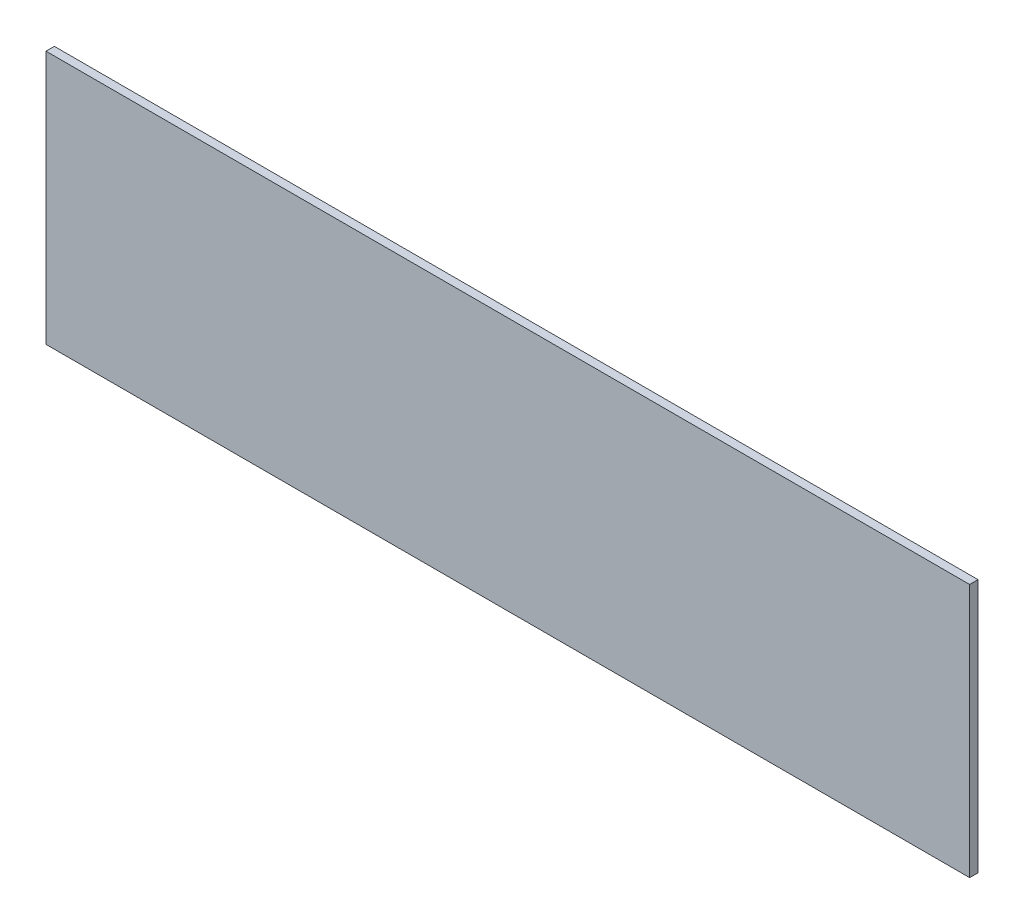
ISO-10303-21;
HEADER;
FILE_DESCRIPTION(('STEP AP214'),'2;1');
FILE_NAME('part.step','',(''),(''),'','','');
FILE_SCHEMA(('AUTOMOTIVE_DESIGN { 1 0 10303 214 1 1 1 1 }'));
ENDSEC;
DATA;
#1=APPLICATION_CONTEXT('core data for automotive mechanical design processes');
#2=APPLICATION_PROTOCOL_DEFINITION('international standard','automotive_design',2000,#1);
#3=PRODUCT_CONTEXT('',#1,'mechanical');
#4=PRODUCT('Part','Part','',(#3));
#5=PRODUCT_RELATED_PRODUCT_CATEGORY('part','',(#4));
#6=PRODUCT_DEFINITION_FORMATION('','',#4);
#7=PRODUCT_DEFINITION_CONTEXT('part definition',#1,'design');
#8=PRODUCT_DEFINITION('design','',#6,#7);
#9=PRODUCT_DEFINITION_SHAPE('','',#8);
#10=(LENGTH_UNIT() NAMED_UNIT(*) SI_UNIT(.MILLI.,.METRE.));
#11=(NAMED_UNIT(*) PLANE_ANGLE_UNIT() SI_UNIT($,.RADIAN.));
#12=(NAMED_UNIT(*) SI_UNIT($,.STERADIAN.) SOLID_ANGLE_UNIT());
#13=UNCERTAINTY_MEASURE_WITH_UNIT(LENGTH_MEASURE(1.E-05),#10,'distance_accuracy_value','');
#14=(GEOMETRIC_REPRESENTATION_CONTEXT(3) GLOBAL_UNCERTAINTY_ASSIGNED_CONTEXT((#13)) GLOBAL_UNIT_ASSIGNED_CONTEXT((#10,
#11,#12)) REPRESENTATION_CONTEXT('',''));
#15=CARTESIAN_POINT('',(0.,0.,0.));
#16=DIRECTION('',(0.,0.,1.));
#17=DIRECTION('',(1.,0.,0.));
#18=AXIS2_PLACEMENT_3D('',#15,#16,#17);
#19=CARTESIAN_POINT('',(-113.503324334308,11.5655948278874,1.5));
#20=DIRECTION('',(1.,0.,0.));
#21=DIRECTION('',(0.,0.,-1.));
#22=AXIS2_PLACEMENT_3D('',#19,#20,#21);
#23=PLANE('',#22);
#24=DIRECTION('',(0.,-1.,0.));
#25=VECTOR('',#24,1.);
#26=CARTESIAN_POINT('',(-113.503324334308,11.5655948278874,0.));
#27=LINE('',#26,#25);
#28=CARTESIAN_POINT('',(-113.503324334308,11.5655948278874,0.));
#29=VERTEX_POINT('',#28);
#30=CARTESIAN_POINT('',(-113.503324334308,-33.9344051721126,0.));
#31=VERTEX_POINT('',#30);
#32=EDGE_CURVE('E96',#29,#31,#27,.T.);
#33=ORIENTED_EDGE('',*,*,#32,.T.);
#34=DIRECTION('',(0.,0.,-1.));
#35=VECTOR('',#34,1.);
#36=CARTESIAN_POINT('',(-113.503324334308,-33.9344051721126,1.5));
#37=LINE('',#36,#35);
#38=CARTESIAN_POINT('',(-113.503324334308,-33.9344051721126,1.5));
#39=VERTEX_POINT('',#38);
#40=EDGE_CURVE('E11',#39,#31,#37,.T.);
#41=ORIENTED_EDGE('',*,*,#40,.F.);
#42=DIRECTION('',(0.,-1.,0.));
#43=VECTOR('',#42,1.);
#44=CARTESIAN_POINT('',(-113.503324334308,11.5655948278874,1.5));
#45=LINE('',#44,#43);
#46=CARTESIAN_POINT('',(-113.503324334308,11.5655948278874,1.5));
#47=VERTEX_POINT('',#46);
#48=EDGE_CURVE('E84',#47,#39,#45,.T.);
#49=ORIENTED_EDGE('',*,*,#48,.F.);
#50=DIRECTION('',(0.,0.,-1.));
#51=VECTOR('',#50,1.);
#52=CARTESIAN_POINT('',(-113.503324334308,11.5655948278874,1.5));
#53=LINE('',#52,#51);
#54=EDGE_CURVE('E92',#47,#29,#53,.T.);
#55=ORIENTED_EDGE('',*,*,#54,.T.);
#56=EDGE_LOOP('',(#33,#41,#49,#55));
#57=FACE_BOUND('',#56,.T.);
#58=ADVANCED_FACE('F33',(#57),#23,.F.);
#59=CARTESIAN_POINT('',(-113.503324334308,-33.9344051721126,1.5));
#60=DIRECTION('',(0.,1.,0.));
#61=DIRECTION('',(0.,0.,1.));
#62=AXIS2_PLACEMENT_3D('',#59,#60,#61);
#63=PLANE('',#62);
#64=DIRECTION('',(1.,0.,0.));
#65=VECTOR('',#64,1.);
#66=CARTESIAN_POINT('',(-113.503324334308,-33.9344051721126,0.));
#67=LINE('',#66,#65);
#68=CARTESIAN_POINT('',(51.9966756656919,-33.9344051721126,0.));
#69=VERTEX_POINT('',#68);
#70=EDGE_CURVE('E88',#31,#69,#67,.T.);
#71=ORIENTED_EDGE('',*,*,#70,.T.);
#72=DIRECTION('',(0.,0.,-1.));
#73=VECTOR('',#72,1.);
#74=CARTESIAN_POINT('',(51.9966756656919,-33.9344051721126,1.5));
#75=LINE('',#74,#73);
#76=CARTESIAN_POINT('',(51.9966756656919,-33.9344051721126,1.5));
#77=VERTEX_POINT('',#76);
#78=EDGE_CURVE('E41',#77,#69,#75,.T.);
#79=ORIENTED_EDGE('',*,*,#78,.F.);
#80=DIRECTION('',(1.,0.,0.));
#81=VECTOR('',#80,1.);
#82=CARTESIAN_POINT('',(-113.503324334308,-33.9344051721126,1.5));
#83=LINE('',#82,#81);
#84=EDGE_CURVE('E79',#39,#77,#83,.T.);
#85=ORIENTED_EDGE('',*,*,#84,.F.);
#86=ORIENTED_EDGE('',*,*,#40,.T.);
#87=EDGE_LOOP('',(#71,#79,#85,#86));
#88=FACE_BOUND('',#87,.T.);
#89=ADVANCED_FACE('F87',(#88),#63,.F.);
#90=CARTESIAN_POINT('',(51.9966756656919,11.5655948278874,1.5));
#91=DIRECTION('',(-1.,0.,0.));
#92=DIRECTION('',(0.,0.,1.));
#93=AXIS2_PLACEMENT_3D('',#90,#91,#92);
#94=PLANE('',#93);
#95=DIRECTION('',(0.,1.,0.));
#96=VECTOR('',#95,1.);
#97=CARTESIAN_POINT('',(51.9966756656919,11.5655948278874,0.));
#98=LINE('',#97,#96);
#99=CARTESIAN_POINT('',(51.9966756656919,11.5655948278874,0.));
#100=VERTEX_POINT('',#99);
#101=EDGE_CURVE('E66',#69,#100,#98,.T.);
#102=ORIENTED_EDGE('',*,*,#101,.T.);
#103=DIRECTION('',(0.,0.,-1.));
#104=VECTOR('',#103,1.);
#105=CARTESIAN_POINT('',(51.9966756656919,11.5655948278874,1.5));
#106=LINE('',#105,#104);
#107=CARTESIAN_POINT('',(51.9966756656919,11.5655948278874,1.5));
#108=VERTEX_POINT('',#107);
#109=EDGE_CURVE('E89',#108,#100,#106,.T.);
#110=ORIENTED_EDGE('',*,*,#109,.F.);
#111=DIRECTION('',(0.,1.,0.));
#112=VECTOR('',#111,1.);
#113=CARTESIAN_POINT('',(51.9966756656919,11.5655948278874,1.5));
#114=LINE('',#113,#112);
#115=EDGE_CURVE('E82',#77,#108,#114,.T.);
#116=ORIENTED_EDGE('',*,*,#115,.F.);
#117=ORIENTED_EDGE('',*,*,#78,.T.);
#118=EDGE_LOOP('',(#102,#110,#116,#117));
#119=FACE_BOUND('',#118,.T.);
#120=ADVANCED_FACE('F90',(#119),#94,.F.);
#121=CARTESIAN_POINT('',(-113.503324334308,11.5655948278874,1.5));
#122=DIRECTION('',(0.,-1.,0.));
#123=DIRECTION('',(0.,0.,-1.));
#124=AXIS2_PLACEMENT_3D('',#121,#122,#123);
#125=PLANE('',#124);
#126=DIRECTION('',(-1.,0.,0.));
#127=VECTOR('',#126,1.);
#128=CARTESIAN_POINT('',(-113.503324334308,11.5655948278874,0.));
#129=LINE('',#128,#127);
#130=EDGE_CURVE('E72',#100,#29,#129,.T.);
#131=ORIENTED_EDGE('',*,*,#130,.T.);
#132=ORIENTED_EDGE('',*,*,#54,.F.);
#133=DIRECTION('',(-1.,0.,0.));
#134=VECTOR('',#133,1.);
#135=CARTESIAN_POINT('',(-113.503324334308,11.5655948278874,1.5));
#136=LINE('',#135,#134);
#137=EDGE_CURVE('E49',#108,#47,#136,.T.);
#138=ORIENTED_EDGE('',*,*,#137,.F.);
#139=ORIENTED_EDGE('',*,*,#109,.T.);
#140=EDGE_LOOP('',(#131,#132,#138,#139));
#141=FACE_BOUND('',#140,.T.);
#142=ADVANCED_FACE('F103',(#141),#125,.F.);
#143=CARTESIAN_POINT('',(0.,0.,1.5));
#144=DIRECTION('',(0.,0.,1.));
#145=DIRECTION('',(1.,0.,0.));
#146=AXIS2_PLACEMENT_3D('',#143,#144,#145);
#147=PLANE('',#146);
#148=ORIENTED_EDGE('',*,*,#48,.T.);
#149=ORIENTED_EDGE('',*,*,#84,.T.);
#150=ORIENTED_EDGE('',*,*,#115,.T.);
#151=ORIENTED_EDGE('',*,*,#137,.T.);
#152=EDGE_LOOP('',(#148,#149,#150,#151));
#153=FACE_BOUND('',#152,.T.);
#154=ADVANCED_FACE('F80',(#153),#147,.T.);
#155=CARTESIAN_POINT('',(0.,0.,0.));
#156=DIRECTION('',(0.,0.,1.));
#157=DIRECTION('',(1.,0.,0.));
#158=AXIS2_PLACEMENT_3D('',#155,#156,#157);
#159=PLANE('',#158);
#160=ORIENTED_EDGE('',*,*,#32,.F.);
#161=ORIENTED_EDGE('',*,*,#130,.F.);
#162=ORIENTED_EDGE('',*,*,#101,.F.);
#163=ORIENTED_EDGE('',*,*,#70,.F.);
#164=EDGE_LOOP('',(#160,#161,#162,#163));
#165=FACE_BOUND('',#164,.T.);
#166=ADVANCED_FACE('F106',(#165),#159,.F.);
#167=CLOSED_SHELL('',(#58,#89,#120,#142,#154,#166));
#168=MANIFOLD_SOLID_BREP('B2',#167);
#169=ADVANCED_BREP_SHAPE_REPRESENTATION('',(#18,#168),#14);
#170=SHAPE_DEFINITION_REPRESENTATION(#9,#169);
ENDSEC;
END-ISO-10303-21;
